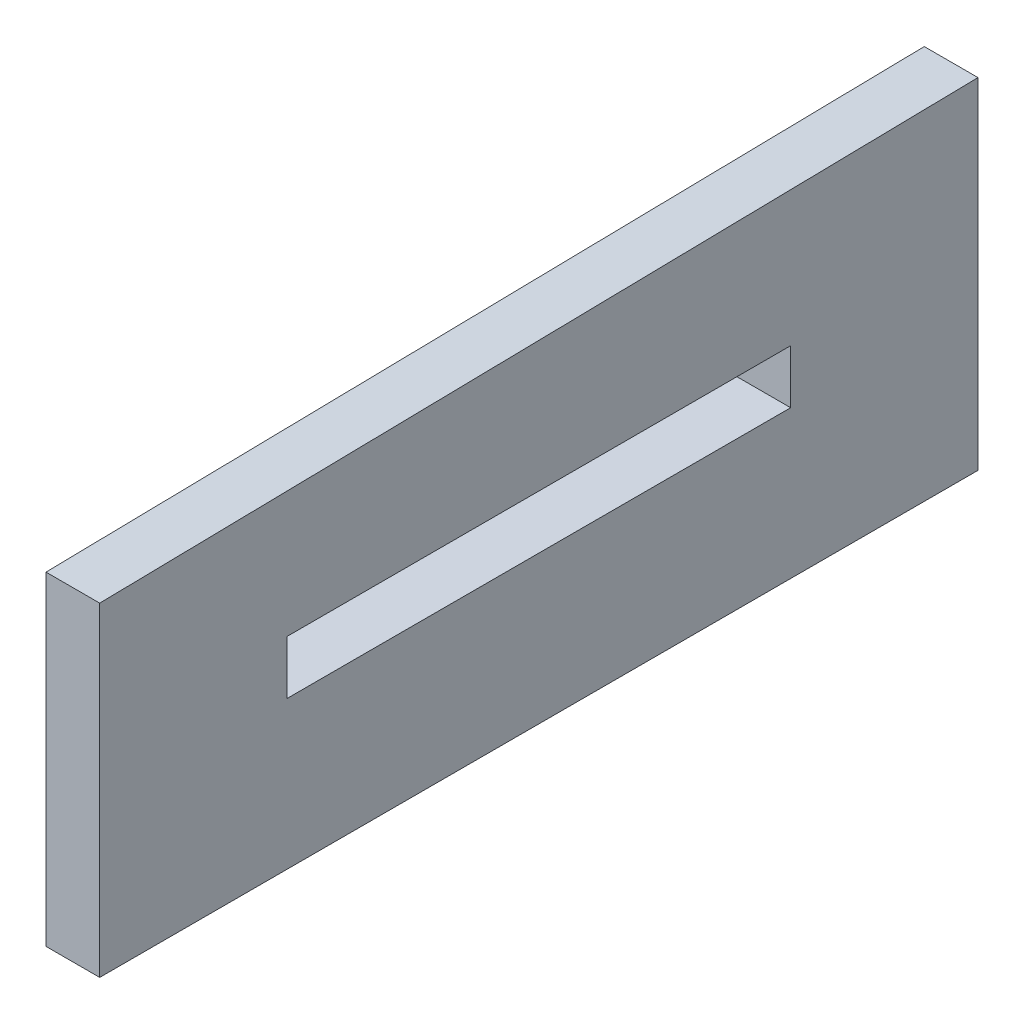
ISO-10303-21;
HEADER;
FILE_DESCRIPTION(('STEP AP214'),'2;1');
FILE_NAME('part.step','',(''),(''),'','','');
FILE_SCHEMA(('AUTOMOTIVE_DESIGN { 1 0 10303 214 1 1 1 1 }'));
ENDSEC;
DATA;
#1=APPLICATION_CONTEXT('core data for automotive mechanical design processes');
#2=APPLICATION_PROTOCOL_DEFINITION('international standard','automotive_design',2000,#1);
#3=PRODUCT_CONTEXT('',#1,'mechanical');
#4=PRODUCT('Part','Part','',(#3));
#5=PRODUCT_RELATED_PRODUCT_CATEGORY('part','',(#4));
#6=PRODUCT_DEFINITION_FORMATION('','',#4);
#7=PRODUCT_DEFINITION_CONTEXT('part definition',#1,'design');
#8=PRODUCT_DEFINITION('design','',#6,#7);
#9=PRODUCT_DEFINITION_SHAPE('','',#8);
#10=(LENGTH_UNIT() NAMED_UNIT(*) SI_UNIT(.MILLI.,.METRE.));
#11=(NAMED_UNIT(*) PLANE_ANGLE_UNIT() SI_UNIT($,.RADIAN.));
#12=(NAMED_UNIT(*) SI_UNIT($,.STERADIAN.) SOLID_ANGLE_UNIT());
#13=UNCERTAINTY_MEASURE_WITH_UNIT(LENGTH_MEASURE(1.E-05),#10,'distance_accuracy_value','');
#14=(GEOMETRIC_REPRESENTATION_CONTEXT(3) GLOBAL_UNCERTAINTY_ASSIGNED_CONTEXT((#13)) GLOBAL_UNIT_ASSIGNED_CONTEXT((#10,
#11,#12)) REPRESENTATION_CONTEXT('',''));
#15=CARTESIAN_POINT('',(0.,0.,0.));
#16=DIRECTION('',(0.,0.,1.));
#17=DIRECTION('',(1.,0.,0.));
#18=AXIS2_PLACEMENT_3D('',#15,#16,#17);
#19=CARTESIAN_POINT('',(3.175,0.,46.637305506));
#20=DIRECTION('',(1.,0.,0.));
#21=DIRECTION('',(0.,0.,1.));
#22=AXIS2_PLACEMENT_3D('',#19,#20,#21);
#23=PLANE('',#22);
#24=DIRECTION('',(0.,-1.,0.));
#25=VECTOR('',#24,1.);
#26=CARTESIAN_POINT('',(3.175,10.525064421,20.683455077));
#27=LINE('',#26,#25);
#28=CARTESIAN_POINT('',(3.175,10.525064421,20.683455077));
#29=VERTEX_POINT('',#28);
#30=CARTESIAN_POINT('',(3.175,-9.579468141,20.683455077));
#31=VERTEX_POINT('',#30);
#32=EDGE_CURVE('E141',#29,#31,#27,.T.);
#33=ORIENTED_EDGE('',*,*,#32,.F.);
#34=DIRECTION('',(0.,0.0182138565789972,-0.99983411395517));
#35=VECTOR('',#34,1.);
#36=CARTESIAN_POINT('',(3.175,9.579468141,72.591155935));
#37=LINE('',#36,#35);
#38=CARTESIAN_POINT('',(3.175,9.579468141,72.591155935));
#39=VERTEX_POINT('',#38);
#40=EDGE_CURVE('E152',#39,#29,#37,.T.);
#41=ORIENTED_EDGE('',*,*,#40,.F.);
#42=DIRECTION('',(0.,1.,0.));
#43=VECTOR('',#42,1.);
#44=CARTESIAN_POINT('',(3.175,9.579468141,72.591155935));
#45=LINE('',#44,#43);
#46=CARTESIAN_POINT('',(3.175,-9.579468141,72.591155935));
#47=VERTEX_POINT('',#46);
#48=EDGE_CURVE('E149',#47,#39,#45,.T.);
#49=ORIENTED_EDGE('',*,*,#48,.F.);
#50=DIRECTION('',(0.,0.,1.));
#51=VECTOR('',#50,1.);
#52=CARTESIAN_POINT('',(3.175,-9.579468141,20.683455077));
#53=LINE('',#52,#51);
#54=EDGE_CURVE('E145',#31,#47,#53,.T.);
#55=ORIENTED_EDGE('',*,*,#54,.F.);
#56=EDGE_LOOP('',(#33,#41,#49,#55));
#57=FACE_BOUND('',#56,.T.);
#58=DIRECTION('',(0.,0.,1.));
#59=VECTOR('',#58,1.);
#60=CARTESIAN_POINT('',(3.175,-0.836413491000004,31.756184519));
#61=LINE('',#60,#59);
#62=CARTESIAN_POINT('',(3.175,-0.836413491000004,31.756184519));
#63=VERTEX_POINT('',#62);
#64=CARTESIAN_POINT('',(3.175,-0.836413491000004,61.518426493));
#65=VERTEX_POINT('',#64);
#66=EDGE_CURVE('E117',#63,#65,#61,.T.);
#67=ORIENTED_EDGE('',*,*,#66,.T.);
#68=DIRECTION('',(0.,1.,0.));
#69=VECTOR('',#68,1.);
#70=CARTESIAN_POINT('',(3.175,2.338586509,61.518426493));
#71=LINE('',#70,#69);
#72=CARTESIAN_POINT('',(3.175,2.338586509,61.518426493));
#73=VERTEX_POINT('',#72);
#74=EDGE_CURVE('E124',#65,#73,#71,.T.);
#75=ORIENTED_EDGE('',*,*,#74,.T.);
#76=DIRECTION('',(0.,0.,-1.));
#77=VECTOR('',#76,1.);
#78=CARTESIAN_POINT('',(3.175,2.338586509,31.756184519));
#79=LINE('',#78,#77);
#80=CARTESIAN_POINT('',(3.175,2.338586509,31.756184519));
#81=VERTEX_POINT('',#80);
#82=EDGE_CURVE('E118',#73,#81,#79,.T.);
#83=ORIENTED_EDGE('',*,*,#82,.T.);
#84=DIRECTION('',(0.,-1.,0.));
#85=VECTOR('',#84,1.);
#86=CARTESIAN_POINT('',(3.175,2.338586509,31.756184519));
#87=LINE('',#86,#85);
#88=EDGE_CURVE('E103',#81,#63,#87,.T.);
#89=ORIENTED_EDGE('',*,*,#88,.T.);
#90=EDGE_LOOP('',(#67,#75,#83,#89));
#91=FACE_BOUND('',#90,.T.);
#92=ADVANCED_FACE('F37',(#57,#91),#23,.T.);
#93=CARTESIAN_POINT('',(0.,0.,46.637305506));
#94=DIRECTION('',(1.,0.,0.));
#95=DIRECTION('',(0.,0.,1.));
#96=AXIS2_PLACEMENT_3D('',#93,#94,#95);
#97=PLANE('',#96);
#98=DIRECTION('',(0.,-1.,0.));
#99=VECTOR('',#98,1.);
#100=CARTESIAN_POINT('',(0.,10.525064421,20.683455077));
#101=LINE('',#100,#99);
#102=CARTESIAN_POINT('',(0.,10.525064421,20.683455077));
#103=VERTEX_POINT('',#102);
#104=CARTESIAN_POINT('',(0.,-9.579468141,20.683455077));
#105=VERTEX_POINT('',#104);
#106=EDGE_CURVE('E111',#103,#105,#101,.T.);
#107=ORIENTED_EDGE('',*,*,#106,.T.);
#108=DIRECTION('',(0.,0.,1.));
#109=VECTOR('',#108,1.);
#110=CARTESIAN_POINT('',(0.,-9.579468141,20.683455077));
#111=LINE('',#110,#109);
#112=CARTESIAN_POINT('',(0.,-9.579468141,72.591155935));
#113=VERTEX_POINT('',#112);
#114=EDGE_CURVE('E159',#105,#113,#111,.T.);
#115=ORIENTED_EDGE('',*,*,#114,.T.);
#116=DIRECTION('',(0.,1.,0.));
#117=VECTOR('',#116,1.);
#118=CARTESIAN_POINT('',(0.,9.579468141,72.591155935));
#119=LINE('',#118,#117);
#120=CARTESIAN_POINT('',(0.,9.579468141,72.591155935));
#121=VERTEX_POINT('',#120);
#122=EDGE_CURVE('E162',#113,#121,#119,.T.);
#123=ORIENTED_EDGE('',*,*,#122,.T.);
#124=DIRECTION('',(0.,0.0182138565789972,-0.99983411395517));
#125=VECTOR('',#124,1.);
#126=CARTESIAN_POINT('',(0.,9.579468141,72.591155935));
#127=LINE('',#126,#125);
#128=EDGE_CURVE('E146',#121,#103,#127,.T.);
#129=ORIENTED_EDGE('',*,*,#128,.T.);
#130=EDGE_LOOP('',(#107,#115,#123,#129));
#131=FACE_BOUND('',#130,.T.);
#132=DIRECTION('',(0.,-1.,0.));
#133=VECTOR('',#132,1.);
#134=CARTESIAN_POINT('',(0.,2.338586509,31.756184519));
#135=LINE('',#134,#133);
#136=CARTESIAN_POINT('',(0.,2.338586509,31.756184519));
#137=VERTEX_POINT('',#136);
#138=CARTESIAN_POINT('',(0.,-0.836413491000004,31.756184519));
#139=VERTEX_POINT('',#138);
#140=EDGE_CURVE('E106',#137,#139,#135,.T.);
#141=ORIENTED_EDGE('',*,*,#140,.F.);
#142=DIRECTION('',(0.,0.,-1.));
#143=VECTOR('',#142,1.);
#144=CARTESIAN_POINT('',(0.,2.338586509,31.756184519));
#145=LINE('',#144,#143);
#146=CARTESIAN_POINT('',(0.,2.338586509,61.518426493));
#147=VERTEX_POINT('',#146);
#148=EDGE_CURVE('E120',#147,#137,#145,.T.);
#149=ORIENTED_EDGE('',*,*,#148,.F.);
#150=DIRECTION('',(0.,1.,0.));
#151=VECTOR('',#150,1.);
#152=CARTESIAN_POINT('',(0.,2.338586509,61.518426493));
#153=LINE('',#152,#151);
#154=CARTESIAN_POINT('',(0.,-0.836413491000004,61.518426493));
#155=VERTEX_POINT('',#154);
#156=EDGE_CURVE('E135',#155,#147,#153,.T.);
#157=ORIENTED_EDGE('',*,*,#156,.F.);
#158=DIRECTION('',(0.,0.,1.));
#159=VECTOR('',#158,1.);
#160=CARTESIAN_POINT('',(0.,-0.836413491000004,31.756184519));
#161=LINE('',#160,#159);
#162=EDGE_CURVE('E133',#139,#155,#161,.T.);
#163=ORIENTED_EDGE('',*,*,#162,.F.);
#164=EDGE_LOOP('',(#141,#149,#157,#163));
#165=FACE_BOUND('',#164,.T.);
#166=ADVANCED_FACE('F180',(#131,#165),#97,.F.);
#167=CARTESIAN_POINT('',(3.175,10.525064421,20.683455077));
#168=DIRECTION('',(0.,0.,1.));
#169=DIRECTION('',(0.,1.,0.));
#170=AXIS2_PLACEMENT_3D('',#167,#168,#169);
#171=PLANE('',#170);
#172=ORIENTED_EDGE('',*,*,#106,.F.);
#173=DIRECTION('',(-1.,0.,0.));
#174=VECTOR('',#173,1.);
#175=CARTESIAN_POINT('',(3.175,10.525064421,20.683455077));
#176=LINE('',#175,#174);
#177=EDGE_CURVE('E156',#29,#103,#176,.T.);
#178=ORIENTED_EDGE('',*,*,#177,.F.);
#179=ORIENTED_EDGE('',*,*,#32,.T.);
#180=DIRECTION('',(-1.,0.,0.));
#181=VECTOR('',#180,1.);
#182=CARTESIAN_POINT('',(3.175,-9.579468141,20.683455077));
#183=LINE('',#182,#181);
#184=EDGE_CURVE('E11',#31,#105,#183,.T.);
#185=ORIENTED_EDGE('',*,*,#184,.T.);
#186=EDGE_LOOP('',(#172,#178,#179,#185));
#187=FACE_BOUND('',#186,.T.);
#188=ADVANCED_FACE('F39',(#187),#171,.F.);
#189=CARTESIAN_POINT('',(3.175,-9.579468141,20.683455077));
#190=DIRECTION('',(0.,1.,0.));
#191=DIRECTION('',(0.,0.,-1.));
#192=AXIS2_PLACEMENT_3D('',#189,#190,#191);
#193=PLANE('',#192);
#194=ORIENTED_EDGE('',*,*,#114,.F.);
#195=ORIENTED_EDGE('',*,*,#184,.F.);
#196=ORIENTED_EDGE('',*,*,#54,.T.);
#197=DIRECTION('',(-1.,0.,0.));
#198=VECTOR('',#197,1.);
#199=CARTESIAN_POINT('',(3.175,-9.579468141,72.591155935));
#200=LINE('',#199,#198);
#201=EDGE_CURVE('E45',#47,#113,#200,.T.);
#202=ORIENTED_EDGE('',*,*,#201,.T.);
#203=EDGE_LOOP('',(#194,#195,#196,#202));
#204=FACE_BOUND('',#203,.T.);
#205=ADVANCED_FACE('F173',(#204),#193,.F.);
#206=CARTESIAN_POINT('',(3.175,9.579468141,72.591155935));
#207=DIRECTION('',(0.,0.,-1.));
#208=DIRECTION('',(0.,-1.,0.));
#209=AXIS2_PLACEMENT_3D('',#206,#207,#208);
#210=PLANE('',#209);
#211=ORIENTED_EDGE('',*,*,#122,.F.);
#212=ORIENTED_EDGE('',*,*,#201,.F.);
#213=ORIENTED_EDGE('',*,*,#48,.T.);
#214=DIRECTION('',(-1.,0.,0.));
#215=VECTOR('',#214,1.);
#216=CARTESIAN_POINT('',(3.175,9.579468141,72.591155935));
#217=LINE('',#216,#215);
#218=EDGE_CURVE('E168',#39,#121,#217,.T.);
#219=ORIENTED_EDGE('',*,*,#218,.T.);
#220=EDGE_LOOP('',(#211,#212,#213,#219));
#221=FACE_BOUND('',#220,.T.);
#222=ADVANCED_FACE('F177',(#221),#210,.F.);
#223=CARTESIAN_POINT('',(3.175,9.579468141,72.591155935));
#224=DIRECTION('',(0.,-0.99983411395517,-0.0182138565789972));
#225=DIRECTION('',(0.,-0.0182138565789972,0.99983411395517));
#226=AXIS2_PLACEMENT_3D('',#223,#224,#225);
#227=PLANE('',#226);
#228=ORIENTED_EDGE('',*,*,#128,.F.);
#229=ORIENTED_EDGE('',*,*,#218,.F.);
#230=ORIENTED_EDGE('',*,*,#40,.T.);
#231=ORIENTED_EDGE('',*,*,#177,.T.);
#232=EDGE_LOOP('',(#228,#229,#230,#231));
#233=FACE_BOUND('',#232,.T.);
#234=ADVANCED_FACE('F188',(#233),#227,.F.);
#235=CARTESIAN_POINT('',(3.175,2.338586509,31.756184519));
#236=DIRECTION('',(0.,0.,1.));
#237=DIRECTION('',(-1.,0.,0.));
#238=AXIS2_PLACEMENT_3D('',#235,#236,#237);
#239=PLANE('',#238);
#240=ORIENTED_EDGE('',*,*,#140,.T.);
#241=DIRECTION('',(-1.,0.,0.));
#242=VECTOR('',#241,1.);
#243=CARTESIAN_POINT('',(3.175,-0.836413491000004,31.756184519));
#244=LINE('',#243,#242);
#245=EDGE_CURVE('E100',#63,#139,#244,.T.);
#246=ORIENTED_EDGE('',*,*,#245,.F.);
#247=ORIENTED_EDGE('',*,*,#88,.F.);
#248=DIRECTION('',(-1.,0.,0.));
#249=VECTOR('',#248,1.);
#250=CARTESIAN_POINT('',(3.175,2.338586509,31.756184519));
#251=LINE('',#250,#249);
#252=EDGE_CURVE('E60',#81,#137,#251,.T.);
#253=ORIENTED_EDGE('',*,*,#252,.T.);
#254=EDGE_LOOP('',(#240,#246,#247,#253));
#255=FACE_BOUND('',#254,.T.);
#256=ADVANCED_FACE('F102',(#255),#239,.T.);
#257=CARTESIAN_POINT('',(3.175,-0.836413491000004,31.756184519));
#258=DIRECTION('',(0.,1.,0.));
#259=DIRECTION('',(0.,0.,-1.));
#260=AXIS2_PLACEMENT_3D('',#257,#258,#259);
#261=PLANE('',#260);
#262=ORIENTED_EDGE('',*,*,#162,.T.);
#263=DIRECTION('',(-1.,0.,0.));
#264=VECTOR('',#263,1.);
#265=CARTESIAN_POINT('',(3.175,-0.836413491000004,61.518426493));
#266=LINE('',#265,#264);
#267=EDGE_CURVE('E112',#65,#155,#266,.T.);
#268=ORIENTED_EDGE('',*,*,#267,.F.);
#269=ORIENTED_EDGE('',*,*,#66,.F.);
#270=ORIENTED_EDGE('',*,*,#245,.T.);
#271=EDGE_LOOP('',(#262,#268,#269,#270));
#272=FACE_BOUND('',#271,.T.);
#273=ADVANCED_FACE('F122',(#272),#261,.T.);
#274=CARTESIAN_POINT('',(3.175,2.338586509,61.518426493));
#275=DIRECTION('',(0.,0.,-1.));
#276=DIRECTION('',(0.,-1.,0.));
#277=AXIS2_PLACEMENT_3D('',#274,#275,#276);
#278=PLANE('',#277);
#279=ORIENTED_EDGE('',*,*,#156,.T.);
#280=DIRECTION('',(-1.,0.,0.));
#281=VECTOR('',#280,1.);
#282=CARTESIAN_POINT('',(3.175,2.338586509,61.518426493));
#283=LINE('',#282,#281);
#284=EDGE_CURVE('E52',#73,#147,#283,.T.);
#285=ORIENTED_EDGE('',*,*,#284,.F.);
#286=ORIENTED_EDGE('',*,*,#74,.F.);
#287=ORIENTED_EDGE('',*,*,#267,.T.);
#288=EDGE_LOOP('',(#279,#285,#286,#287));
#289=FACE_BOUND('',#288,.T.);
#290=ADVANCED_FACE('F206',(#289),#278,.T.);
#291=CARTESIAN_POINT('',(3.175,2.338586509,31.756184519));
#292=DIRECTION('',(0.,-1.,0.));
#293=DIRECTION('',(0.,0.,1.));
#294=AXIS2_PLACEMENT_3D('',#291,#292,#293);
#295=PLANE('',#294);
#296=ORIENTED_EDGE('',*,*,#148,.T.);
#297=ORIENTED_EDGE('',*,*,#252,.F.);
#298=ORIENTED_EDGE('',*,*,#82,.F.);
#299=ORIENTED_EDGE('',*,*,#284,.T.);
#300=EDGE_LOOP('',(#296,#297,#298,#299));
#301=FACE_BOUND('',#300,.T.);
#302=ADVANCED_FACE('F209',(#301),#295,.T.);
#303=CLOSED_SHELL('',(#92,#166,#188,#205,#222,#234,#256,#273,#290,#302));
#304=MANIFOLD_SOLID_BREP('B2',#303);
#305=ADVANCED_BREP_SHAPE_REPRESENTATION('',(#18,#304),#14);
#306=SHAPE_DEFINITION_REPRESENTATION(#9,#305);
ENDSEC;
END-ISO-10303-21;
